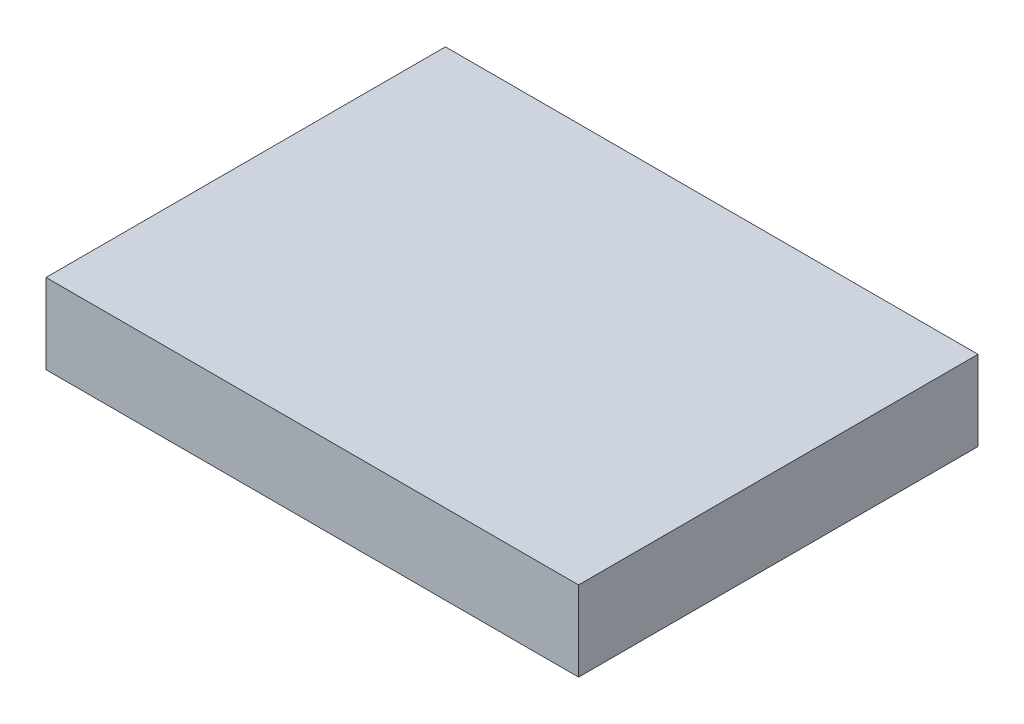
ISO-10303-21;
HEADER;
FILE_DESCRIPTION(('STEP AP214'),'2;1');
FILE_NAME('part.step','',(''),(''),'','','');
FILE_SCHEMA(('AUTOMOTIVE_DESIGN { 1 0 10303 214 1 1 1 1 }'));
ENDSEC;
DATA;
#1=APPLICATION_CONTEXT('core data for automotive mechanical design processes');
#2=APPLICATION_PROTOCOL_DEFINITION('international standard','automotive_design',2000,#1);
#3=PRODUCT_CONTEXT('',#1,'mechanical');
#4=PRODUCT('Part','Part','',(#3));
#5=PRODUCT_RELATED_PRODUCT_CATEGORY('part','',(#4));
#6=PRODUCT_DEFINITION_FORMATION('','',#4);
#7=PRODUCT_DEFINITION_CONTEXT('part definition',#1,'design');
#8=PRODUCT_DEFINITION('design','',#6,#7);
#9=PRODUCT_DEFINITION_SHAPE('','',#8);
#10=(LENGTH_UNIT() NAMED_UNIT(*) SI_UNIT(.MILLI.,.METRE.));
#11=(NAMED_UNIT(*) PLANE_ANGLE_UNIT() SI_UNIT($,.RADIAN.));
#12=(NAMED_UNIT(*) SI_UNIT($,.STERADIAN.) SOLID_ANGLE_UNIT());
#13=UNCERTAINTY_MEASURE_WITH_UNIT(LENGTH_MEASURE(1.E-05),#10,'distance_accuracy_value','');
#14=(GEOMETRIC_REPRESENTATION_CONTEXT(3) GLOBAL_UNCERTAINTY_ASSIGNED_CONTEXT((#13)) GLOBAL_UNIT_ASSIGNED_CONTEXT((#10,
#11,#12)) REPRESENTATION_CONTEXT('',''));
#15=CARTESIAN_POINT('',(0.,0.,0.));
#16=DIRECTION('',(0.,0.,1.));
#17=DIRECTION('',(1.,0.,0.));
#18=AXIS2_PLACEMENT_3D('',#15,#16,#17);
#19=CARTESIAN_POINT('',(-254.,76.2,-190.5));
#20=DIRECTION('',(1.,0.,0.));
#21=DIRECTION('',(0.,0.,-1.));
#22=AXIS2_PLACEMENT_3D('',#19,#20,#21);
#23=PLANE('',#22);
#24=DIRECTION('',(0.,0.,1.));
#25=VECTOR('',#24,1.);
#26=CARTESIAN_POINT('',(-254.,0.,-190.5));
#27=LINE('',#26,#25);
#28=CARTESIAN_POINT('',(-254.,0.,-190.5));
#29=VERTEX_POINT('',#28);
#30=CARTESIAN_POINT('',(-254.,0.,190.5));
#31=VERTEX_POINT('',#30);
#32=EDGE_CURVE('E97',#29,#31,#27,.T.);
#33=ORIENTED_EDGE('',*,*,#32,.T.);
#34=DIRECTION('',(0.,-1.,0.));
#35=VECTOR('',#34,1.);
#36=CARTESIAN_POINT('',(-254.,76.2,190.5));
#37=LINE('',#36,#35);
#38=CARTESIAN_POINT('',(-254.,76.2,190.5));
#39=VERTEX_POINT('',#38);
#40=EDGE_CURVE('E11',#39,#31,#37,.T.);
#41=ORIENTED_EDGE('',*,*,#40,.F.);
#42=DIRECTION('',(0.,0.,1.));
#43=VECTOR('',#42,1.);
#44=CARTESIAN_POINT('',(-254.,76.2,-190.5));
#45=LINE('',#44,#43);
#46=CARTESIAN_POINT('',(-254.,76.2,-190.5));
#47=VERTEX_POINT('',#46);
#48=EDGE_CURVE('E85',#47,#39,#45,.T.);
#49=ORIENTED_EDGE('',*,*,#48,.F.);
#50=DIRECTION('',(0.,-1.,0.));
#51=VECTOR('',#50,1.);
#52=CARTESIAN_POINT('',(-254.,76.2,-190.5));
#53=LINE('',#52,#51);
#54=EDGE_CURVE('E93',#47,#29,#53,.T.);
#55=ORIENTED_EDGE('',*,*,#54,.T.);
#56=EDGE_LOOP('',(#33,#41,#49,#55));
#57=FACE_BOUND('',#56,.T.);
#58=ADVANCED_FACE('F34',(#57),#23,.F.);
#59=CARTESIAN_POINT('',(-254.,76.2,190.5));
#60=DIRECTION('',(0.,0.,-1.));
#61=DIRECTION('',(-1.,0.,0.));
#62=AXIS2_PLACEMENT_3D('',#59,#60,#61);
#63=PLANE('',#62);
#64=DIRECTION('',(1.,0.,0.));
#65=VECTOR('',#64,1.);
#66=CARTESIAN_POINT('',(-254.,0.,190.5));
#67=LINE('',#66,#65);
#68=CARTESIAN_POINT('',(254.,0.,190.5));
#69=VERTEX_POINT('',#68);
#70=EDGE_CURVE('E89',#31,#69,#67,.T.);
#71=ORIENTED_EDGE('',*,*,#70,.T.);
#72=DIRECTION('',(0.,-1.,0.));
#73=VECTOR('',#72,1.);
#74=CARTESIAN_POINT('',(254.,76.2,190.5));
#75=LINE('',#74,#73);
#76=CARTESIAN_POINT('',(254.,76.2,190.5));
#77=VERTEX_POINT('',#76);
#78=EDGE_CURVE('E42',#77,#69,#75,.T.);
#79=ORIENTED_EDGE('',*,*,#78,.F.);
#80=DIRECTION('',(1.,0.,0.));
#81=VECTOR('',#80,1.);
#82=CARTESIAN_POINT('',(-254.,76.2,190.5));
#83=LINE('',#82,#81);
#84=EDGE_CURVE('E80',#39,#77,#83,.T.);
#85=ORIENTED_EDGE('',*,*,#84,.F.);
#86=ORIENTED_EDGE('',*,*,#40,.T.);
#87=EDGE_LOOP('',(#71,#79,#85,#86));
#88=FACE_BOUND('',#87,.T.);
#89=ADVANCED_FACE('F88',(#88),#63,.F.);
#90=CARTESIAN_POINT('',(254.,76.2,-190.5));
#91=DIRECTION('',(-1.,0.,0.));
#92=DIRECTION('',(0.,0.,1.));
#93=AXIS2_PLACEMENT_3D('',#90,#91,#92);
#94=PLANE('',#93);
#95=DIRECTION('',(0.,0.,-1.));
#96=VECTOR('',#95,1.);
#97=CARTESIAN_POINT('',(254.,0.,-190.5));
#98=LINE('',#97,#96);
#99=CARTESIAN_POINT('',(254.,0.,-190.5));
#100=VERTEX_POINT('',#99);
#101=EDGE_CURVE('E67',#69,#100,#98,.T.);
#102=ORIENTED_EDGE('',*,*,#101,.T.);
#103=DIRECTION('',(0.,-1.,0.));
#104=VECTOR('',#103,1.);
#105=CARTESIAN_POINT('',(254.,76.2,-190.5));
#106=LINE('',#105,#104);
#107=CARTESIAN_POINT('',(254.,76.2,-190.5));
#108=VERTEX_POINT('',#107);
#109=EDGE_CURVE('E90',#108,#100,#106,.T.);
#110=ORIENTED_EDGE('',*,*,#109,.F.);
#111=DIRECTION('',(0.,0.,-1.));
#112=VECTOR('',#111,1.);
#113=CARTESIAN_POINT('',(254.,76.2,-190.5));
#114=LINE('',#113,#112);
#115=EDGE_CURVE('E83',#77,#108,#114,.T.);
#116=ORIENTED_EDGE('',*,*,#115,.F.);
#117=ORIENTED_EDGE('',*,*,#78,.T.);
#118=EDGE_LOOP('',(#102,#110,#116,#117));
#119=FACE_BOUND('',#118,.T.);
#120=ADVANCED_FACE('F91',(#119),#94,.F.);
#121=CARTESIAN_POINT('',(-254.,76.2,-190.5));
#122=DIRECTION('',(0.,0.,1.));
#123=DIRECTION('',(1.,0.,0.));
#124=AXIS2_PLACEMENT_3D('',#121,#122,#123);
#125=PLANE('',#124);
#126=DIRECTION('',(-1.,0.,0.));
#127=VECTOR('',#126,1.);
#128=CARTESIAN_POINT('',(-254.,0.,-190.5));
#129=LINE('',#128,#127);
#130=EDGE_CURVE('E73',#100,#29,#129,.T.);
#131=ORIENTED_EDGE('',*,*,#130,.T.);
#132=ORIENTED_EDGE('',*,*,#54,.F.);
#133=DIRECTION('',(-1.,0.,0.));
#134=VECTOR('',#133,1.);
#135=CARTESIAN_POINT('',(-254.,76.2,-190.5));
#136=LINE('',#135,#134);
#137=EDGE_CURVE('E50',#108,#47,#136,.T.);
#138=ORIENTED_EDGE('',*,*,#137,.F.);
#139=ORIENTED_EDGE('',*,*,#109,.T.);
#140=EDGE_LOOP('',(#131,#132,#138,#139));
#141=FACE_BOUND('',#140,.T.);
#142=ADVANCED_FACE('F104',(#141),#125,.F.);
#143=CARTESIAN_POINT('',(0.,76.2,0.));
#144=DIRECTION('',(0.,1.,0.));
#145=DIRECTION('',(0.,0.,1.));
#146=AXIS2_PLACEMENT_3D('',#143,#144,#145);
#147=PLANE('',#146);
#148=ORIENTED_EDGE('',*,*,#48,.T.);
#149=ORIENTED_EDGE('',*,*,#84,.T.);
#150=ORIENTED_EDGE('',*,*,#115,.T.);
#151=ORIENTED_EDGE('',*,*,#137,.T.);
#152=EDGE_LOOP('',(#148,#149,#150,#151));
#153=FACE_BOUND('',#152,.T.);
#154=ADVANCED_FACE('F81',(#153),#147,.T.);
#155=CARTESIAN_POINT('',(0.,0.,0.));
#156=DIRECTION('',(0.,1.,0.));
#157=DIRECTION('',(0.,0.,1.));
#158=AXIS2_PLACEMENT_3D('',#155,#156,#157);
#159=PLANE('',#158);
#160=ORIENTED_EDGE('',*,*,#32,.F.);
#161=ORIENTED_EDGE('',*,*,#130,.F.);
#162=ORIENTED_EDGE('',*,*,#101,.F.);
#163=ORIENTED_EDGE('',*,*,#70,.F.);
#164=EDGE_LOOP('',(#160,#161,#162,#163));
#165=FACE_BOUND('',#164,.T.);
#166=ADVANCED_FACE('F107',(#165),#159,.F.);
#167=CLOSED_SHELL('',(#58,#89,#120,#142,#154,#166));
#168=MANIFOLD_SOLID_BREP('B2',#167);
#169=ADVANCED_BREP_SHAPE_REPRESENTATION('',(#18,#168),#14);
#170=SHAPE_DEFINITION_REPRESENTATION(#9,#169);
ENDSEC;
END-ISO-10303-21;
